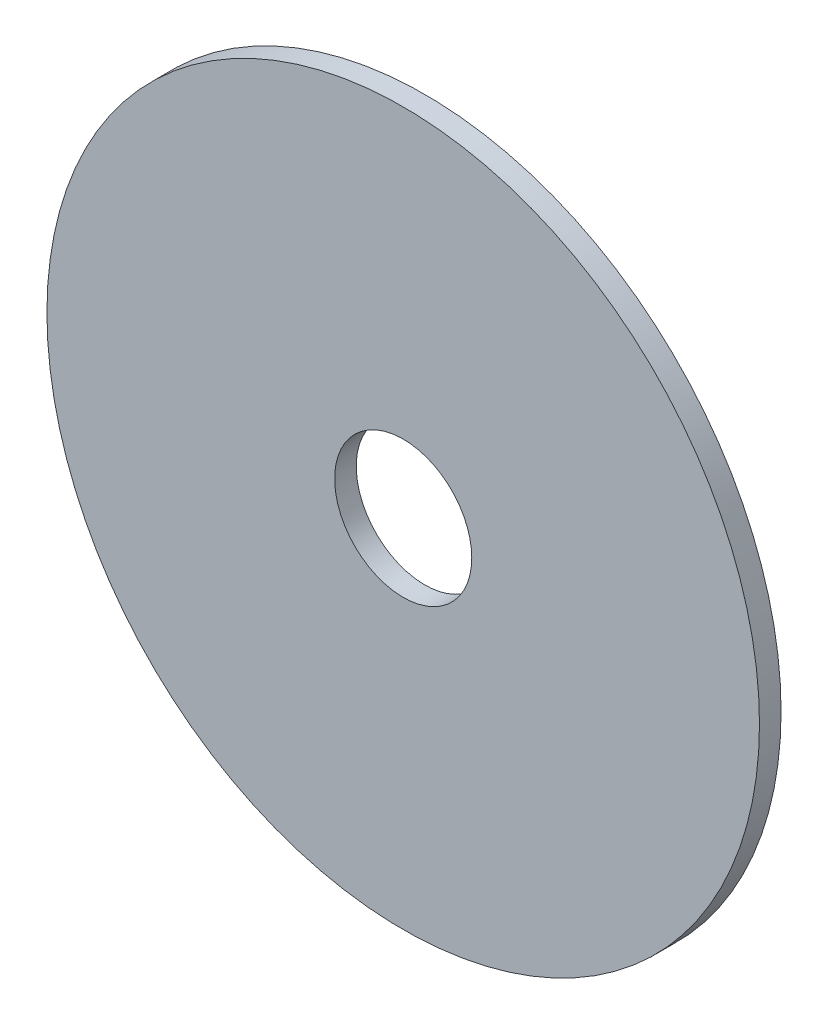
ISO-10303-21;
HEADER;
FILE_DESCRIPTION(('STEP AP214'),'2;1');
FILE_NAME('part.step','',(''),(''),'','','');
FILE_SCHEMA(('AUTOMOTIVE_DESIGN { 1 0 10303 214 1 1 1 1 }'));
ENDSEC;
DATA;
#1=APPLICATION_CONTEXT('core data for automotive mechanical design processes');
#2=APPLICATION_PROTOCOL_DEFINITION('international standard','automotive_design',2000,#1);
#3=PRODUCT_CONTEXT('',#1,'mechanical');
#4=PRODUCT('Part','Part','',(#3));
#5=PRODUCT_RELATED_PRODUCT_CATEGORY('part','',(#4));
#6=PRODUCT_DEFINITION_FORMATION('','',#4);
#7=PRODUCT_DEFINITION_CONTEXT('part definition',#1,'design');
#8=PRODUCT_DEFINITION('design','',#6,#7);
#9=PRODUCT_DEFINITION_SHAPE('','',#8);
#10=(LENGTH_UNIT() NAMED_UNIT(*) SI_UNIT(.MILLI.,.METRE.));
#11=(NAMED_UNIT(*) PLANE_ANGLE_UNIT() SI_UNIT($,.RADIAN.));
#12=(NAMED_UNIT(*) SI_UNIT($,.STERADIAN.) SOLID_ANGLE_UNIT());
#13=UNCERTAINTY_MEASURE_WITH_UNIT(LENGTH_MEASURE(1.E-05),#10,'distance_accuracy_value','');
#14=(GEOMETRIC_REPRESENTATION_CONTEXT(3) GLOBAL_UNCERTAINTY_ASSIGNED_CONTEXT((#13)) GLOBAL_UNIT_ASSIGNED_CONTEXT((#10,
#11,#12)) REPRESENTATION_CONTEXT('',''));
#15=CARTESIAN_POINT('',(0.,0.,0.));
#16=DIRECTION('',(0.,0.,1.));
#17=DIRECTION('',(1.,0.,0.));
#18=AXIS2_PLACEMENT_3D('',#15,#16,#17);
#19=CARTESIAN_POINT('',(-9.13559904100294E-12,2.50887072465867E-11,2.));
#20=DIRECTION('',(0.,0.,1.));
#21=DIRECTION('',(1.,0.,0.));
#22=AXIS2_PLACEMENT_3D('',#19,#20,#21);
#23=PLANE('',#22);
#24=CARTESIAN_POINT('',(-9.13559904100294E-12,2.50887072465867E-11,2.));
#25=DIRECTION('',(0.,0.,1.));
#26=DIRECTION('',(1.,0.,0.));
#27=AXIS2_PLACEMENT_3D('',#24,#25,#26);
#28=CIRCLE('',#27,33.);
#29=CARTESIAN_POINT('',(32.9999999999909,2.50887072465867E-11,2.));
#30=VERTEX_POINT('',#29);
#31=EDGE_CURVE('E10',#30,#30,#28,.T.);
#32=ORIENTED_EDGE('',*,*,#31,.T.);
#33=EDGE_LOOP('',(#32));
#34=FACE_BOUND('',#33,.T.);
#35=CARTESIAN_POINT('',(7.160765118725E-12,-1.57829582736468E-11,2.));
#36=DIRECTION('',(0.,0.,1.));
#37=DIRECTION('',(1.,0.,0.));
#38=AXIS2_PLACEMENT_3D('',#35,#36,#37);
#39=CIRCLE('',#38,6.34999990463257);
#40=CARTESIAN_POINT('',(6.34999990463973,-1.57829582736468E-11,2.));
#41=VERTEX_POINT('',#40);
#42=EDGE_CURVE('E44',#41,#41,#39,.T.);
#43=ORIENTED_EDGE('',*,*,#42,.F.);
#44=EDGE_LOOP('',(#43));
#45=FACE_BOUND('',#44,.T.);
#46=ADVANCED_FACE('F33',(#34,#45),#23,.T.);
#47=CARTESIAN_POINT('',(-9.13559904100294E-12,2.50887072465867E-11,0.));
#48=DIRECTION('',(0.,0.,1.));
#49=DIRECTION('',(1.,0.,0.));
#50=AXIS2_PLACEMENT_3D('',#47,#48,#49);
#51=PLANE('',#50);
#52=CARTESIAN_POINT('',(-9.13559904100294E-12,2.50887072465867E-11,0.));
#53=DIRECTION('',(0.,0.,1.));
#54=DIRECTION('',(1.,0.,0.));
#55=AXIS2_PLACEMENT_3D('',#52,#53,#54);
#56=CIRCLE('',#55,33.);
#57=CARTESIAN_POINT('',(32.9999999999909,2.50887072465867E-11,0.));
#58=VERTEX_POINT('',#57);
#59=EDGE_CURVE('E37',#58,#58,#56,.T.);
#60=ORIENTED_EDGE('',*,*,#59,.F.);
#61=EDGE_LOOP('',(#60));
#62=FACE_BOUND('',#61,.T.);
#63=CARTESIAN_POINT('',(7.160765118725E-12,-1.57829582736468E-11,0.));
#64=DIRECTION('',(0.,0.,1.));
#65=DIRECTION('',(1.,0.,0.));
#66=AXIS2_PLACEMENT_3D('',#63,#64,#65);
#67=CIRCLE('',#66,6.34999990463257);
#68=CARTESIAN_POINT('',(6.34999990463973,-1.57829582736468E-11,0.));
#69=VERTEX_POINT('',#68);
#70=EDGE_CURVE('E46',#69,#69,#67,.T.);
#71=ORIENTED_EDGE('',*,*,#70,.T.);
#72=EDGE_LOOP('',(#71));
#73=FACE_BOUND('',#72,.T.);
#74=ADVANCED_FACE('F56',(#62,#73),#51,.F.);
#75=CARTESIAN_POINT('',(-9.13559904100294E-12,2.50887072465867E-11,2.));
#76=DIRECTION('',(0.,0.,-1.));
#77=DIRECTION('',(-1.,0.,0.));
#78=AXIS2_PLACEMENT_3D('',#75,#76,#77);
#79=CYLINDRICAL_SURFACE('',#78,33.);
#80=ORIENTED_EDGE('',*,*,#31,.F.);
#81=EDGE_LOOP('',(#80));
#82=FACE_BOUND('',#81,.T.);
#83=ORIENTED_EDGE('',*,*,#59,.T.);
#84=EDGE_LOOP('',(#83));
#85=FACE_BOUND('',#84,.T.);
#86=ADVANCED_FACE('F35',(#82,#85),#79,.T.);
#87=CARTESIAN_POINT('',(7.160765118725E-12,-1.57829582736468E-11,2.));
#88=DIRECTION('',(0.,0.,-1.));
#89=DIRECTION('',(-1.,0.,0.));
#90=AXIS2_PLACEMENT_3D('',#87,#88,#89);
#91=CYLINDRICAL_SURFACE('',#90,6.34999990463257);
#92=ORIENTED_EDGE('',*,*,#42,.T.);
#93=EDGE_LOOP('',(#92));
#94=FACE_BOUND('',#93,.T.);
#95=ORIENTED_EDGE('',*,*,#70,.F.);
#96=EDGE_LOOP('',(#95));
#97=FACE_BOUND('',#96,.T.);
#98=ADVANCED_FACE('F52',(#94,#97),#91,.F.);
#99=CLOSED_SHELL('',(#46,#74,#86,#98));
#100=MANIFOLD_SOLID_BREP('B2',#99);
#101=ADVANCED_BREP_SHAPE_REPRESENTATION('',(#18,#100),#14);
#102=SHAPE_DEFINITION_REPRESENTATION(#9,#101);
ENDSEC;
END-ISO-10303-21;
